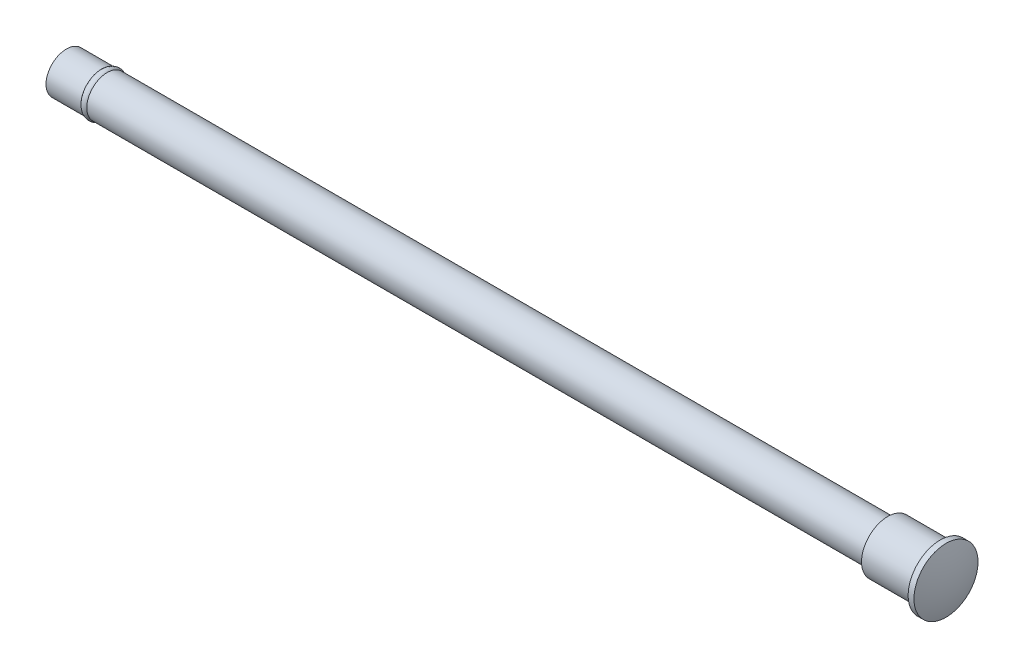
ISO-10303-21;
HEADER;
FILE_DESCRIPTION(('STEP AP214'),'2;1');
FILE_NAME('part.step','',(''),(''),'','','');
FILE_SCHEMA(('AUTOMOTIVE_DESIGN { 1 0 10303 214 1 1 1 1 }'));
ENDSEC;
DATA;
#1=APPLICATION_CONTEXT('core data for automotive mechanical design processes');
#2=APPLICATION_PROTOCOL_DEFINITION('international standard','automotive_design',2000,#1);
#3=PRODUCT_CONTEXT('',#1,'mechanical');
#4=PRODUCT('Part','Part','',(#3));
#5=PRODUCT_RELATED_PRODUCT_CATEGORY('part','',(#4));
#6=PRODUCT_DEFINITION_FORMATION('','',#4);
#7=PRODUCT_DEFINITION_CONTEXT('part definition',#1,'design');
#8=PRODUCT_DEFINITION('design','',#6,#7);
#9=PRODUCT_DEFINITION_SHAPE('','',#8);
#10=(LENGTH_UNIT() NAMED_UNIT(*) SI_UNIT(.MILLI.,.METRE.));
#11=(NAMED_UNIT(*) PLANE_ANGLE_UNIT() SI_UNIT($,.RADIAN.));
#12=(NAMED_UNIT(*) SI_UNIT($,.STERADIAN.) SOLID_ANGLE_UNIT());
#13=UNCERTAINTY_MEASURE_WITH_UNIT(LENGTH_MEASURE(1.E-05),#10,'distance_accuracy_value','');
#14=(GEOMETRIC_REPRESENTATION_CONTEXT(3) GLOBAL_UNCERTAINTY_ASSIGNED_CONTEXT((#13)) GLOBAL_UNIT_ASSIGNED_CONTEXT((#10,
#11,#12)) REPRESENTATION_CONTEXT('',''));
#15=CARTESIAN_POINT('',(0.,0.,0.));
#16=DIRECTION('',(0.,0.,1.));
#17=DIRECTION('',(1.,0.,0.));
#18=AXIS2_PLACEMENT_3D('',#15,#16,#17);
#19=CARTESIAN_POINT('',(0.,0.,0.));
#20=DIRECTION('',(-1.,0.,0.));
#21=DIRECTION('',(0.,0.,1.));
#22=AXIS2_PLACEMENT_3D('',#19,#20,#21);
#23=CYLINDRICAL_SURFACE('',#22,3.5);
#24=CARTESIAN_POINT('',(141.,0.,0.));
#25=DIRECTION('',(-1.,0.,0.));
#26=DIRECTION('',(0.,0.,1.));
#27=AXIS2_PLACEMENT_3D('',#24,#25,#26);
#28=CIRCLE('',#27,3.5);
#29=CARTESIAN_POINT('',(141.,0.,3.5));
#30=VERTEX_POINT('',#29);
#31=EDGE_CURVE('E46',#30,#30,#28,.T.);
#32=ORIENTED_EDGE('',*,*,#31,.T.);
#33=EDGE_LOOP('',(#32));
#34=FACE_BOUND('',#33,.T.);
#35=CARTESIAN_POINT('',(7.,0.,0.));
#36=DIRECTION('',(-1.,0.,0.));
#37=DIRECTION('',(0.,0.,1.));
#38=AXIS2_PLACEMENT_3D('',#35,#36,#37);
#39=CIRCLE('',#38,3.5);
#40=CARTESIAN_POINT('',(7.,0.,3.5));
#41=VERTEX_POINT('',#40);
#42=EDGE_CURVE('E38',#41,#41,#39,.T.);
#43=ORIENTED_EDGE('',*,*,#42,.F.);
#44=EDGE_LOOP('',(#43));
#45=FACE_BOUND('',#44,.T.);
#46=ADVANCED_FACE('F31',(#34,#45),#23,.T.);
#47=CARTESIAN_POINT('',(141.,3.5,0.));
#48=DIRECTION('',(1.,0.,0.));
#49=DIRECTION('',(0.,0.,-1.));
#50=AXIS2_PLACEMENT_3D('',#47,#48,#49);
#51=PLANE('',#50);
#52=ORIENTED_EDGE('',*,*,#31,.F.);
#53=EDGE_LOOP('',(#52));
#54=FACE_BOUND('',#53,.T.);
#55=CARTESIAN_POINT('',(141.,0.,0.));
#56=DIRECTION('',(-1.,0.,0.));
#57=DIRECTION('',(0.,0.,1.));
#58=AXIS2_PLACEMENT_3D('',#55,#56,#57);
#59=CIRCLE('',#58,4.5);
#60=CARTESIAN_POINT('',(141.,0.,4.5));
#61=VERTEX_POINT('',#60);
#62=EDGE_CURVE('E51',#61,#61,#59,.T.);
#63=ORIENTED_EDGE('',*,*,#62,.T.);
#64=EDGE_LOOP('',(#63));
#65=FACE_BOUND('',#64,.T.);
#66=ADVANCED_FACE('F89',(#54,#65),#51,.F.);
#67=CARTESIAN_POINT('',(0.,0.,0.));
#68=DIRECTION('',(-1.,0.,0.));
#69=DIRECTION('',(0.,0.,1.));
#70=AXIS2_PLACEMENT_3D('',#67,#68,#69);
#71=CYLINDRICAL_SURFACE('',#70,4.5);
#72=ORIENTED_EDGE('',*,*,#62,.F.);
#73=EDGE_LOOP('',(#72));
#74=FACE_BOUND('',#73,.T.);
#75=CARTESIAN_POINT('',(150.,0.,0.));
#76=DIRECTION('',(-1.,0.,0.));
#77=DIRECTION('',(0.,0.,1.));
#78=AXIS2_PLACEMENT_3D('',#75,#76,#77);
#79=CIRCLE('',#78,4.5);
#80=CARTESIAN_POINT('',(150.,0.,4.5));
#81=VERTEX_POINT('',#80);
#82=EDGE_CURVE('E54',#81,#81,#79,.T.);
#83=ORIENTED_EDGE('',*,*,#82,.T.);
#84=EDGE_LOOP('',(#83));
#85=FACE_BOUND('',#84,.T.);
#86=ADVANCED_FACE('F94',(#74,#85),#71,.T.);
#87=CARTESIAN_POINT('',(150.,4.5,0.));
#88=DIRECTION('',(1.,0.,0.));
#89=DIRECTION('',(0.,0.,-1.));
#90=AXIS2_PLACEMENT_3D('',#87,#88,#89);
#91=PLANE('',#90);
#92=ORIENTED_EDGE('',*,*,#82,.F.);
#93=EDGE_LOOP('',(#92));
#94=FACE_BOUND('',#93,.T.);
#95=CARTESIAN_POINT('',(150.,0.,0.));
#96=DIRECTION('',(-1.,0.,0.));
#97=DIRECTION('',(0.,0.,1.));
#98=AXIS2_PLACEMENT_3D('',#95,#96,#97);
#99=CIRCLE('',#98,5.5);
#100=CARTESIAN_POINT('',(150.,0.,5.5));
#101=VERTEX_POINT('',#100);
#102=EDGE_CURVE('E57',#101,#101,#99,.T.);
#103=ORIENTED_EDGE('',*,*,#102,.T.);
#104=EDGE_LOOP('',(#103));
#105=FACE_BOUND('',#104,.T.);
#106=ADVANCED_FACE('F103',(#94,#105),#91,.F.);
#107=CARTESIAN_POINT('',(0.,0.,0.));
#108=DIRECTION('',(-1.,0.,0.));
#109=DIRECTION('',(0.,0.,1.));
#110=AXIS2_PLACEMENT_3D('',#107,#108,#109);
#111=CYLINDRICAL_SURFACE('',#110,5.5);
#112=ORIENTED_EDGE('',*,*,#102,.F.);
#113=EDGE_LOOP('',(#112));
#114=FACE_BOUND('',#113,.T.);
#115=CARTESIAN_POINT('',(151.,0.,0.));
#116=DIRECTION('',(-1.,0.,0.));
#117=DIRECTION('',(0.,0.,1.));
#118=AXIS2_PLACEMENT_3D('',#115,#116,#117);
#119=CIRCLE('',#118,5.5);
#120=CARTESIAN_POINT('',(151.,0.,5.5));
#121=VERTEX_POINT('',#120);
#122=EDGE_CURVE('E60',#121,#121,#119,.T.);
#123=ORIENTED_EDGE('',*,*,#122,.T.);
#124=EDGE_LOOP('',(#123));
#125=FACE_BOUND('',#124,.T.);
#126=ADVANCED_FACE('F109',(#114,#125),#111,.T.);
#127=CARTESIAN_POINT('',(136.375,0.,0.));
#128=DIRECTION('',(-1.,0.,0.));
#129=DIRECTION('',(0.,1.,0.));
#130=AXIS2_PLACEMENT_3D('',#127,#128,#129);
#131=SPHERICAL_SURFACE('',#130,15.625);
#132=ORIENTED_EDGE('',*,*,#122,.F.);
#133=EDGE_LOOP('',(#132));
#134=FACE_BOUND('',#133,.T.);
#135=ADVANCED_FACE('F115',(#134),#131,.T.);
#136=CARTESIAN_POINT('',(6.50000000000001,0.,0.));
#137=DIRECTION('',(-1.,0.,0.));
#138=DIRECTION('',(0.,0.,1.));
#139=AXIS2_PLACEMENT_3D('',#136,#137,#138);
#140=TOROIDAL_SURFACE('',#139,2.975,0.725000000000001);
#141=CARTESIAN_POINT('',(6.00000000000001,0.,0.));
#142=DIRECTION('',(1.,0.,0.));
#143=DIRECTION('',(0.,0.,-1.));
#144=AXIS2_PLACEMENT_3D('',#141,#142,#143);
#145=CIRCLE('',#144,3.5);
#146=CARTESIAN_POINT('',(6.00000000000001,0.,-3.5));
#147=VERTEX_POINT('',#146);
#148=EDGE_CURVE('E10',#147,#147,#145,.T.);
#149=ORIENTED_EDGE('',*,*,#148,.T.);
#150=EDGE_LOOP('',(#149));
#151=FACE_BOUND('',#150,.T.);
#152=ORIENTED_EDGE('',*,*,#42,.T.);
#153=EDGE_LOOP('',(#152));
#154=FACE_BOUND('',#153,.T.);
#155=ADVANCED_FACE('F76',(#151,#154),#140,.T.);
#156=CARTESIAN_POINT('',(0.,0.,0.));
#157=DIRECTION('',(1.,0.,0.));
#158=DIRECTION('',(0.,0.,-1.));
#159=AXIS2_PLACEMENT_3D('',#156,#157,#158);
#160=PLANE('',#159);
#161=CARTESIAN_POINT('',(0.,0.,0.));
#162=DIRECTION('',(-1.,0.,0.));
#163=DIRECTION('',(0.,0.,1.));
#164=AXIS2_PLACEMENT_3D('',#161,#162,#163);
#165=CIRCLE('',#164,2.2);
#166=CARTESIAN_POINT('',(0.,0.,2.2));
#167=VERTEX_POINT('',#166);
#168=EDGE_CURVE('E66',#167,#167,#165,.T.);
#169=ORIENTED_EDGE('',*,*,#168,.F.);
#170=EDGE_LOOP('',(#169));
#171=FACE_BOUND('',#170,.T.);
#172=CARTESIAN_POINT('',(0.,0.,0.));
#173=DIRECTION('',(-1.,0.,0.));
#174=DIRECTION('',(0.,0.,1.));
#175=AXIS2_PLACEMENT_3D('',#172,#173,#174);
#176=CIRCLE('',#175,3.5);
#177=CARTESIAN_POINT('',(0.,0.,3.5));
#178=VERTEX_POINT('',#177);
#179=EDGE_CURVE('E42',#178,#178,#176,.T.);
#180=ORIENTED_EDGE('',*,*,#179,.T.);
#181=EDGE_LOOP('',(#180));
#182=FACE_BOUND('',#181,.T.);
#183=ADVANCED_FACE('F33',(#171,#182),#160,.F.);
#184=ORIENTED_EDGE('',*,*,#179,.F.);
#185=EDGE_LOOP('',(#184));
#186=FACE_BOUND('',#185,.T.);
#187=ORIENTED_EDGE('',*,*,#148,.F.);
#188=EDGE_LOOP('',(#187));
#189=FACE_BOUND('',#188,.T.);
#190=ADVANCED_FACE('F75',(#186,#189),#23,.T.);
#191=CARTESIAN_POINT('',(150.,4.5,0.));
#192=DIRECTION('',(1.,0.,0.));
#193=DIRECTION('',(0.,0.,-1.));
#194=AXIS2_PLACEMENT_3D('',#191,#192,#193);
#195=PLANE('',#194);
#196=CARTESIAN_POINT('',(150.,0.,0.));
#197=DIRECTION('',(1.,0.,0.));
#198=DIRECTION('',(0.,0.,-1.));
#199=AXIS2_PLACEMENT_3D('',#196,#197,#198);
#200=CIRCLE('',#199,2.2);
#201=CARTESIAN_POINT('',(150.,0.,-2.2));
#202=VERTEX_POINT('',#201);
#203=EDGE_CURVE('E63',#202,#202,#200,.F.);
#204=ORIENTED_EDGE('',*,*,#203,.T.);
#205=EDGE_LOOP('',(#204));
#206=FACE_BOUND('',#205,.T.);
#207=ADVANCED_FACE('F81',(#206),#195,.F.);
#208=CARTESIAN_POINT('',(156.222539674442,0.,0.));
#209=DIRECTION('',(-1.,0.,0.));
#210=DIRECTION('',(0.,0.,1.));
#211=AXIS2_PLACEMENT_3D('',#208,#209,#210);
#212=CYLINDRICAL_SURFACE('',#211,2.2);
#213=ORIENTED_EDGE('',*,*,#168,.T.);
#214=EDGE_LOOP('',(#213));
#215=FACE_BOUND('',#214,.T.);
#216=ORIENTED_EDGE('',*,*,#203,.F.);
#217=EDGE_LOOP('',(#216));
#218=FACE_BOUND('',#217,.T.);
#219=ADVANCED_FACE('F70',(#215,#218),#212,.F.);
#220=CLOSED_SHELL('',(#46,#66,#86,#106,#126,#135,#155,#183,#190,#207,#219));
#221=MANIFOLD_SOLID_BREP('B2',#220);
#222=ADVANCED_BREP_SHAPE_REPRESENTATION('',(#18,#221),#14);
#223=SHAPE_DEFINITION_REPRESENTATION(#9,#222);
ENDSEC;
END-ISO-10303-21;
